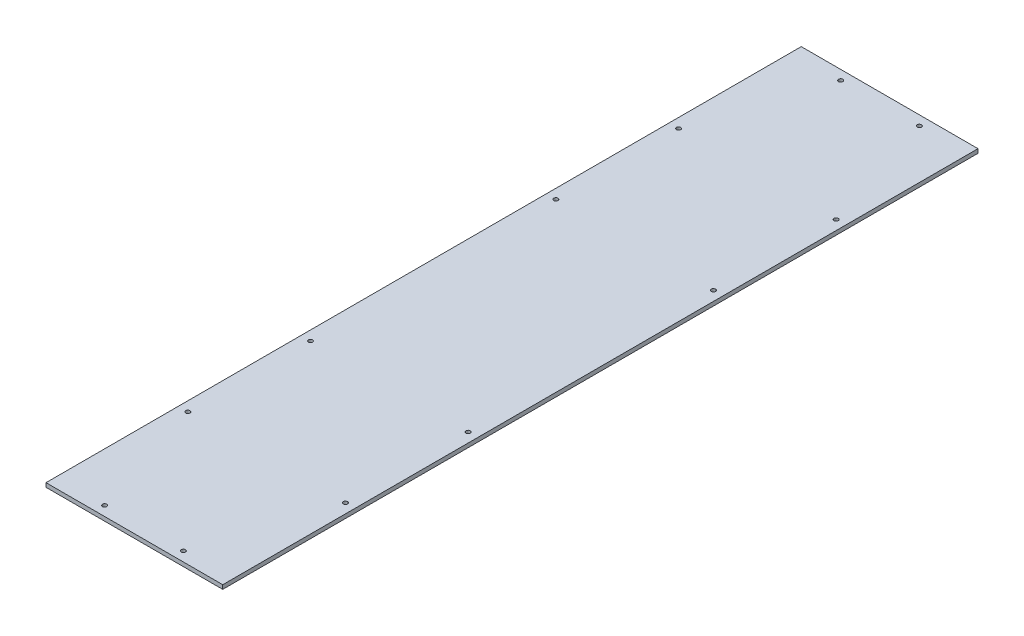
ISO-10303-21;
HEADER;
FILE_DESCRIPTION(('STEP AP214'),'2;1');
FILE_NAME('part.step','',(''),(''),'','','');
FILE_SCHEMA(('AUTOMOTIVE_DESIGN { 1 0 10303 214 1 1 1 1 }'));
ENDSEC;
DATA;
#1=APPLICATION_CONTEXT('core data for automotive mechanical design processes');
#2=APPLICATION_PROTOCOL_DEFINITION('international standard','automotive_design',2000,#1);
#3=PRODUCT_CONTEXT('',#1,'mechanical');
#4=PRODUCT('Part','Part','',(#3));
#5=PRODUCT_RELATED_PRODUCT_CATEGORY('part','',(#4));
#6=PRODUCT_DEFINITION_FORMATION('','',#4);
#7=PRODUCT_DEFINITION_CONTEXT('part definition',#1,'design');
#8=PRODUCT_DEFINITION('design','',#6,#7);
#9=PRODUCT_DEFINITION_SHAPE('','',#8);
#10=(LENGTH_UNIT() NAMED_UNIT(*) SI_UNIT(.MILLI.,.METRE.));
#11=(NAMED_UNIT(*) PLANE_ANGLE_UNIT() SI_UNIT($,.RADIAN.));
#12=(NAMED_UNIT(*) SI_UNIT($,.STERADIAN.) SOLID_ANGLE_UNIT());
#13=UNCERTAINTY_MEASURE_WITH_UNIT(LENGTH_MEASURE(1.E-05),#10,'distance_accuracy_value','');
#14=(GEOMETRIC_REPRESENTATION_CONTEXT(3) GLOBAL_UNCERTAINTY_ASSIGNED_CONTEXT((#13)) GLOBAL_UNIT_ASSIGNED_CONTEXT((#10,
#11,#12)) REPRESENTATION_CONTEXT('',''));
#15=CARTESIAN_POINT('',(0.,0.,0.));
#16=DIRECTION('',(0.,0.,1.));
#17=DIRECTION('',(1.,0.,0.));
#18=AXIS2_PLACEMENT_3D('',#15,#16,#17);
#19=CARTESIAN_POINT('',(0.,3.175,0.));
#20=DIRECTION('',(0.,1.,0.));
#21=DIRECTION('',(0.,0.,1.));
#22=AXIS2_PLACEMENT_3D('',#19,#20,#21);
#23=PLANE('',#22);
#24=CARTESIAN_POINT('',(-61.6,3.175,191.848333333333));
#25=DIRECTION('',(0.,1.,0.));
#26=DIRECTION('',(0.,0.,-1.));
#27=AXIS2_PLACEMENT_3D('',#24,#25,#26);
#28=CIRCLE('',#27,1.65);
#29=CARTESIAN_POINT('',(-61.6,3.175,190.198333333333));
#30=VERTEX_POINT('',#29);
#31=EDGE_CURVE('E169',#30,#30,#28,.T.);
#32=ORIENTED_EDGE('',*,*,#31,.F.);
#33=EDGE_LOOP('',(#32));
#34=FACE_BOUND('',#33,.T.);
#35=CARTESIAN_POINT('',(61.6000000000001,3.175,95.9216666666667));
#36=DIRECTION('',(0.,1.,0.));
#37=DIRECTION('',(0.,0.,1.));
#38=AXIS2_PLACEMENT_3D('',#35,#36,#37);
#39=CIRCLE('',#38,1.65);
#40=CARTESIAN_POINT('',(61.6000000000001,3.175,97.5716666666667));
#41=VERTEX_POINT('',#40);
#42=EDGE_CURVE('E157',#41,#41,#39,.T.);
#43=ORIENTED_EDGE('',*,*,#42,.F.);
#44=EDGE_LOOP('',(#43));
#45=FACE_BOUND('',#44,.T.);
#46=CARTESIAN_POINT('',(30.8000000000001,3.175,287.775));
#47=DIRECTION('',(0.,1.,0.));
#48=DIRECTION('',(0.,0.,1.));
#49=AXIS2_PLACEMENT_3D('',#46,#47,#48);
#50=CIRCLE('',#49,1.65000000000001);
#51=CARTESIAN_POINT('',(30.8000000000001,3.175,289.425));
#52=VERTEX_POINT('',#51);
#53=EDGE_CURVE('E145',#52,#52,#50,.T.);
#54=ORIENTED_EDGE('',*,*,#53,.F.);
#55=EDGE_LOOP('',(#54));
#56=FACE_BOUND('',#55,.T.);
#57=CARTESIAN_POINT('',(61.6000000000001,3.175,-191.848333333333));
#58=DIRECTION('',(0.,1.,0.));
#59=DIRECTION('',(0.,0.,-1.));
#60=AXIS2_PLACEMENT_3D('',#57,#58,#59);
#61=CIRCLE('',#60,1.65);
#62=CARTESIAN_POINT('',(61.6000000000001,3.175,-193.498333333333));
#63=VERTEX_POINT('',#62);
#64=EDGE_CURVE('E133',#63,#63,#61,.T.);
#65=ORIENTED_EDGE('',*,*,#64,.F.);
#66=EDGE_LOOP('',(#65));
#67=FACE_BOUND('',#66,.T.);
#68=CARTESIAN_POINT('',(-61.6,3.175,-95.9216666666666));
#69=DIRECTION('',(0.,1.,0.));
#70=DIRECTION('',(0.,0.,1.));
#71=AXIS2_PLACEMENT_3D('',#68,#69,#70);
#72=CIRCLE('',#71,1.65);
#73=CARTESIAN_POINT('',(-61.6,3.175,-94.2716666666666));
#74=VERTEX_POINT('',#73);
#75=EDGE_CURVE('E121',#74,#74,#72,.T.);
#76=ORIENTED_EDGE('',*,*,#75,.F.);
#77=EDGE_LOOP('',(#76));
#78=FACE_BOUND('',#77,.T.);
#79=CARTESIAN_POINT('',(-30.8,3.175,-287.775));
#80=DIRECTION('',(0.,1.,0.));
#81=DIRECTION('',(0.,0.,1.));
#82=AXIS2_PLACEMENT_3D('',#79,#80,#81);
#83=CIRCLE('',#82,1.65000000000001);
#84=CARTESIAN_POINT('',(-30.8,3.175,-286.125));
#85=VERTEX_POINT('',#84);
#86=EDGE_CURVE('E100',#85,#85,#83,.T.);
#87=ORIENTED_EDGE('',*,*,#86,.F.);
#88=EDGE_LOOP('',(#87));
#89=FACE_BOUND('',#88,.T.);
#90=DIRECTION('',(0.,0.,-1.));
#91=VECTOR('',#90,1.);
#92=CARTESIAN_POINT('',(69.1000000000001,3.175,-295.275));
#93=LINE('',#92,#91);
#94=CARTESIAN_POINT('',(69.1000000000001,3.175,295.275));
#95=VERTEX_POINT('',#94);
#96=CARTESIAN_POINT('',(69.1000000000001,3.175,-295.275));
#97=VERTEX_POINT('',#96);
#98=EDGE_CURVE('E85',#95,#97,#93,.T.);
#99=ORIENTED_EDGE('',*,*,#98,.T.);
#100=DIRECTION('',(-1.,0.,0.));
#101=VECTOR('',#100,1.);
#102=CARTESIAN_POINT('',(-69.0999999999999,3.175,-295.275));
#103=LINE('',#102,#101);
#104=CARTESIAN_POINT('',(-69.0999999999999,3.175,-295.275));
#105=VERTEX_POINT('',#104);
#106=EDGE_CURVE('E80',#97,#105,#103,.T.);
#107=ORIENTED_EDGE('',*,*,#106,.T.);
#108=DIRECTION('',(0.,0.,1.));
#109=VECTOR('',#108,1.);
#110=CARTESIAN_POINT('',(-69.0999999999999,3.175,-295.275));
#111=LINE('',#110,#109);
#112=CARTESIAN_POINT('',(-69.0999999999999,3.175,295.275));
#113=VERTEX_POINT('',#112);
#114=EDGE_CURVE('E83',#105,#113,#111,.T.);
#115=ORIENTED_EDGE('',*,*,#114,.T.);
#116=DIRECTION('',(1.,0.,0.));
#117=VECTOR('',#116,1.);
#118=CARTESIAN_POINT('',(-69.0999999999999,3.175,295.275));
#119=LINE('',#118,#117);
#120=EDGE_CURVE('E50',#113,#95,#119,.T.);
#121=ORIENTED_EDGE('',*,*,#120,.T.);
#122=EDGE_LOOP('',(#99,#107,#115,#121));
#123=FACE_BOUND('',#122,.T.);
#124=CARTESIAN_POINT('',(-61.6,3.175,-191.848333333333));
#125=DIRECTION('',(0.,1.,0.));
#126=DIRECTION('',(0.,0.,1.));
#127=AXIS2_PLACEMENT_3D('',#124,#125,#126);
#128=CIRCLE('',#127,1.65);
#129=CARTESIAN_POINT('',(-61.6,3.175,-190.198333333333));
#130=VERTEX_POINT('',#129);
#131=EDGE_CURVE('E115',#130,#130,#128,.T.);
#132=ORIENTED_EDGE('',*,*,#131,.F.);
#133=EDGE_LOOP('',(#132));
#134=FACE_BOUND('',#133,.T.);
#135=CARTESIAN_POINT('',(61.6000000000001,3.175,-95.9216666666666));
#136=DIRECTION('',(0.,1.,0.));
#137=DIRECTION('',(0.,0.,-1.));
#138=AXIS2_PLACEMENT_3D('',#135,#136,#137);
#139=CIRCLE('',#138,1.65);
#140=CARTESIAN_POINT('',(61.6000000000001,3.175,-97.5716666666666));
#141=VERTEX_POINT('',#140);
#142=EDGE_CURVE('E127',#141,#141,#139,.T.);
#143=ORIENTED_EDGE('',*,*,#142,.F.);
#144=EDGE_LOOP('',(#143));
#145=FACE_BOUND('',#144,.T.);
#146=CARTESIAN_POINT('',(30.8000000000001,3.175,-287.775));
#147=DIRECTION('',(0.,1.,0.));
#148=DIRECTION('',(0.,0.,-1.));
#149=AXIS2_PLACEMENT_3D('',#146,#147,#148);
#150=CIRCLE('',#149,1.65000000000001);
#151=CARTESIAN_POINT('',(30.8000000000001,3.175,-289.425));
#152=VERTEX_POINT('',#151);
#153=EDGE_CURVE('E139',#152,#152,#150,.T.);
#154=ORIENTED_EDGE('',*,*,#153,.F.);
#155=EDGE_LOOP('',(#154));
#156=FACE_BOUND('',#155,.T.);
#157=CARTESIAN_POINT('',(61.6000000000001,3.175,191.848333333333));
#158=DIRECTION('',(0.,1.,0.));
#159=DIRECTION('',(0.,0.,1.));
#160=AXIS2_PLACEMENT_3D('',#157,#158,#159);
#161=CIRCLE('',#160,1.65);
#162=CARTESIAN_POINT('',(61.6000000000001,3.175,193.498333333333));
#163=VERTEX_POINT('',#162);
#164=EDGE_CURVE('E151',#163,#163,#161,.T.);
#165=ORIENTED_EDGE('',*,*,#164,.F.);
#166=EDGE_LOOP('',(#165));
#167=FACE_BOUND('',#166,.T.);
#168=CARTESIAN_POINT('',(-61.6,3.175,95.9216666666667));
#169=DIRECTION('',(0.,1.,0.));
#170=DIRECTION('',(0.,0.,-1.));
#171=AXIS2_PLACEMENT_3D('',#168,#169,#170);
#172=CIRCLE('',#171,1.65);
#173=CARTESIAN_POINT('',(-61.6,3.175,94.2716666666667));
#174=VERTEX_POINT('',#173);
#175=EDGE_CURVE('E163',#174,#174,#172,.T.);
#176=ORIENTED_EDGE('',*,*,#175,.F.);
#177=EDGE_LOOP('',(#176));
#178=FACE_BOUND('',#177,.T.);
#179=CARTESIAN_POINT('',(-30.8,3.175,287.775));
#180=DIRECTION('',(0.,1.,0.));
#181=DIRECTION('',(0.,0.,-1.));
#182=AXIS2_PLACEMENT_3D('',#179,#180,#181);
#183=CIRCLE('',#182,1.65000000000001);
#184=CARTESIAN_POINT('',(-30.8,3.175,286.125));
#185=VERTEX_POINT('',#184);
#186=EDGE_CURVE('E175',#185,#185,#183,.T.);
#187=ORIENTED_EDGE('',*,*,#186,.F.);
#188=EDGE_LOOP('',(#187));
#189=FACE_BOUND('',#188,.T.);
#190=ADVANCED_FACE('F33',(#34,#45,#56,#67,#78,#89,#123,#134,#145,#156,#167,#178,#189),#23,.T.);
#191=CARTESIAN_POINT('',(0.,0.,0.));
#192=DIRECTION('',(0.,1.,0.));
#193=DIRECTION('',(0.,0.,1.));
#194=AXIS2_PLACEMENT_3D('',#191,#192,#193);
#195=PLANE('',#194);
#196=DIRECTION('',(0.,0.,-1.));
#197=VECTOR('',#196,1.);
#198=CARTESIAN_POINT('',(69.1000000000001,0.,-295.275));
#199=LINE('',#198,#197);
#200=CARTESIAN_POINT('',(69.1000000000001,0.,295.275));
#201=VERTEX_POINT('',#200);
#202=CARTESIAN_POINT('',(69.1000000000001,0.,-295.275));
#203=VERTEX_POINT('',#202);
#204=EDGE_CURVE('E97',#201,#203,#199,.T.);
#205=ORIENTED_EDGE('',*,*,#204,.F.);
#206=DIRECTION('',(1.,0.,0.));
#207=VECTOR('',#206,1.);
#208=CARTESIAN_POINT('',(-69.0999999999999,0.,295.275));
#209=LINE('',#208,#207);
#210=CARTESIAN_POINT('',(-69.0999999999999,0.,295.275));
#211=VERTEX_POINT('',#210);
#212=EDGE_CURVE('E73',#211,#201,#209,.T.);
#213=ORIENTED_EDGE('',*,*,#212,.F.);
#214=DIRECTION('',(0.,0.,1.));
#215=VECTOR('',#214,1.);
#216=CARTESIAN_POINT('',(-69.0999999999999,0.,-295.275));
#217=LINE('',#216,#215);
#218=CARTESIAN_POINT('',(-69.0999999999999,0.,-295.275));
#219=VERTEX_POINT('',#218);
#220=EDGE_CURVE('E67',#219,#211,#217,.T.);
#221=ORIENTED_EDGE('',*,*,#220,.F.);
#222=DIRECTION('',(-1.,0.,0.));
#223=VECTOR('',#222,1.);
#224=CARTESIAN_POINT('',(-69.0999999999999,0.,-295.275));
#225=LINE('',#224,#223);
#226=EDGE_CURVE('E89',#203,#219,#225,.T.);
#227=ORIENTED_EDGE('',*,*,#226,.F.);
#228=EDGE_LOOP('',(#205,#213,#221,#227));
#229=FACE_BOUND('',#228,.T.);
#230=CARTESIAN_POINT('',(-30.8,0.,-287.775));
#231=DIRECTION('',(0.,1.,0.));
#232=DIRECTION('',(0.,0.,1.));
#233=AXIS2_PLACEMENT_3D('',#230,#231,#232);
#234=CIRCLE('',#233,1.65000000000001);
#235=CARTESIAN_POINT('',(-30.8,0.,-286.125));
#236=VERTEX_POINT('',#235);
#237=EDGE_CURVE('E112',#236,#236,#234,.T.);
#238=ORIENTED_EDGE('',*,*,#237,.T.);
#239=EDGE_LOOP('',(#238));
#240=FACE_BOUND('',#239,.T.);
#241=CARTESIAN_POINT('',(-61.6,0.,-191.848333333333));
#242=DIRECTION('',(0.,1.,0.));
#243=DIRECTION('',(0.,0.,1.));
#244=AXIS2_PLACEMENT_3D('',#241,#242,#243);
#245=CIRCLE('',#244,1.65);
#246=CARTESIAN_POINT('',(-61.6,0.,-190.198333333333));
#247=VERTEX_POINT('',#246);
#248=EDGE_CURVE('E118',#247,#247,#245,.T.);
#249=ORIENTED_EDGE('',*,*,#248,.T.);
#250=EDGE_LOOP('',(#249));
#251=FACE_BOUND('',#250,.T.);
#252=CARTESIAN_POINT('',(-61.6,0.,-95.9216666666666));
#253=DIRECTION('',(0.,1.,0.));
#254=DIRECTION('',(0.,0.,1.));
#255=AXIS2_PLACEMENT_3D('',#252,#253,#254);
#256=CIRCLE('',#255,1.65);
#257=CARTESIAN_POINT('',(-61.6,0.,-94.2716666666666));
#258=VERTEX_POINT('',#257);
#259=EDGE_CURVE('E124',#258,#258,#256,.T.);
#260=ORIENTED_EDGE('',*,*,#259,.T.);
#261=EDGE_LOOP('',(#260));
#262=FACE_BOUND('',#261,.T.);
#263=CARTESIAN_POINT('',(61.6000000000001,0.,-95.9216666666666));
#264=DIRECTION('',(0.,1.,0.));
#265=DIRECTION('',(0.,0.,-1.));
#266=AXIS2_PLACEMENT_3D('',#263,#264,#265);
#267=CIRCLE('',#266,1.65);
#268=CARTESIAN_POINT('',(61.6000000000001,0.,-97.5716666666666));
#269=VERTEX_POINT('',#268);
#270=EDGE_CURVE('E130',#269,#269,#267,.T.);
#271=ORIENTED_EDGE('',*,*,#270,.T.);
#272=EDGE_LOOP('',(#271));
#273=FACE_BOUND('',#272,.T.);
#274=CARTESIAN_POINT('',(61.6000000000001,0.,-191.848333333333));
#275=DIRECTION('',(0.,1.,0.));
#276=DIRECTION('',(0.,0.,-1.));
#277=AXIS2_PLACEMENT_3D('',#274,#275,#276);
#278=CIRCLE('',#277,1.65);
#279=CARTESIAN_POINT('',(61.6000000000001,0.,-193.498333333333));
#280=VERTEX_POINT('',#279);
#281=EDGE_CURVE('E136',#280,#280,#278,.T.);
#282=ORIENTED_EDGE('',*,*,#281,.T.);
#283=EDGE_LOOP('',(#282));
#284=FACE_BOUND('',#283,.T.);
#285=CARTESIAN_POINT('',(30.8000000000001,0.,-287.775));
#286=DIRECTION('',(0.,1.,0.));
#287=DIRECTION('',(0.,0.,-1.));
#288=AXIS2_PLACEMENT_3D('',#285,#286,#287);
#289=CIRCLE('',#288,1.65000000000001);
#290=CARTESIAN_POINT('',(30.8000000000001,0.,-289.425));
#291=VERTEX_POINT('',#290);
#292=EDGE_CURVE('E142',#291,#291,#289,.T.);
#293=ORIENTED_EDGE('',*,*,#292,.T.);
#294=EDGE_LOOP('',(#293));
#295=FACE_BOUND('',#294,.T.);
#296=CARTESIAN_POINT('',(30.8000000000001,0.,287.775));
#297=DIRECTION('',(0.,1.,0.));
#298=DIRECTION('',(0.,0.,1.));
#299=AXIS2_PLACEMENT_3D('',#296,#297,#298);
#300=CIRCLE('',#299,1.65000000000001);
#301=CARTESIAN_POINT('',(30.8000000000001,0.,289.425));
#302=VERTEX_POINT('',#301);
#303=EDGE_CURVE('E148',#302,#302,#300,.T.);
#304=ORIENTED_EDGE('',*,*,#303,.T.);
#305=EDGE_LOOP('',(#304));
#306=FACE_BOUND('',#305,.T.);
#307=CARTESIAN_POINT('',(61.6000000000001,0.,191.848333333333));
#308=DIRECTION('',(0.,1.,0.));
#309=DIRECTION('',(0.,0.,1.));
#310=AXIS2_PLACEMENT_3D('',#307,#308,#309);
#311=CIRCLE('',#310,1.65);
#312=CARTESIAN_POINT('',(61.6000000000001,0.,193.498333333333));
#313=VERTEX_POINT('',#312);
#314=EDGE_CURVE('E154',#313,#313,#311,.T.);
#315=ORIENTED_EDGE('',*,*,#314,.T.);
#316=EDGE_LOOP('',(#315));
#317=FACE_BOUND('',#316,.T.);
#318=CARTESIAN_POINT('',(61.6000000000001,0.,95.9216666666667));
#319=DIRECTION('',(0.,1.,0.));
#320=DIRECTION('',(0.,0.,1.));
#321=AXIS2_PLACEMENT_3D('',#318,#319,#320);
#322=CIRCLE('',#321,1.65);
#323=CARTESIAN_POINT('',(61.6000000000001,0.,97.5716666666667));
#324=VERTEX_POINT('',#323);
#325=EDGE_CURVE('E160',#324,#324,#322,.T.);
#326=ORIENTED_EDGE('',*,*,#325,.T.);
#327=EDGE_LOOP('',(#326));
#328=FACE_BOUND('',#327,.T.);
#329=CARTESIAN_POINT('',(-61.6,0.,95.9216666666667));
#330=DIRECTION('',(0.,1.,0.));
#331=DIRECTION('',(0.,0.,-1.));
#332=AXIS2_PLACEMENT_3D('',#329,#330,#331);
#333=CIRCLE('',#332,1.65);
#334=CARTESIAN_POINT('',(-61.6,0.,94.2716666666667));
#335=VERTEX_POINT('',#334);
#336=EDGE_CURVE('E166',#335,#335,#333,.T.);
#337=ORIENTED_EDGE('',*,*,#336,.T.);
#338=EDGE_LOOP('',(#337));
#339=FACE_BOUND('',#338,.T.);
#340=CARTESIAN_POINT('',(-61.6,0.,191.848333333333));
#341=DIRECTION('',(0.,1.,0.));
#342=DIRECTION('',(0.,0.,-1.));
#343=AXIS2_PLACEMENT_3D('',#340,#341,#342);
#344=CIRCLE('',#343,1.65);
#345=CARTESIAN_POINT('',(-61.6,0.,190.198333333333));
#346=VERTEX_POINT('',#345);
#347=EDGE_CURVE('E172',#346,#346,#344,.T.);
#348=ORIENTED_EDGE('',*,*,#347,.T.);
#349=EDGE_LOOP('',(#348));
#350=FACE_BOUND('',#349,.T.);
#351=CARTESIAN_POINT('',(-30.8,0.,287.775));
#352=DIRECTION('',(0.,1.,0.));
#353=DIRECTION('',(0.,0.,-1.));
#354=AXIS2_PLACEMENT_3D('',#351,#352,#353);
#355=CIRCLE('',#354,1.65000000000001);
#356=CARTESIAN_POINT('',(-30.8,0.,286.125));
#357=VERTEX_POINT('',#356);
#358=EDGE_CURVE('E178',#357,#357,#355,.T.);
#359=ORIENTED_EDGE('',*,*,#358,.T.);
#360=EDGE_LOOP('',(#359));
#361=FACE_BOUND('',#360,.T.);
#362=ADVANCED_FACE('F108',(#229,#240,#251,#262,#273,#284,#295,#306,#317,#328,#339,#350,#361),
#195,.F.);
#363=CARTESIAN_POINT('',(69.1000000000001,3.175,-295.275));
#364=DIRECTION('',(-1.,0.,0.));
#365=DIRECTION('',(0.,0.,1.));
#366=AXIS2_PLACEMENT_3D('',#363,#364,#365);
#367=PLANE('',#366);
#368=ORIENTED_EDGE('',*,*,#204,.T.);
#369=DIRECTION('',(0.,-1.,0.));
#370=VECTOR('',#369,1.);
#371=CARTESIAN_POINT('',(69.1000000000001,3.175,-295.275));
#372=LINE('',#371,#370);
#373=EDGE_CURVE('E11',#97,#203,#372,.T.);
#374=ORIENTED_EDGE('',*,*,#373,.F.);
#375=ORIENTED_EDGE('',*,*,#98,.F.);
#376=DIRECTION('',(0.,-1.,0.));
#377=VECTOR('',#376,1.);
#378=CARTESIAN_POINT('',(69.1000000000001,3.175,295.275));
#379=LINE('',#378,#377);
#380=EDGE_CURVE('E93',#95,#201,#379,.T.);
#381=ORIENTED_EDGE('',*,*,#380,.T.);
#382=EDGE_LOOP('',(#368,#374,#375,#381));
#383=FACE_BOUND('',#382,.T.);
#384=ADVANCED_FACE('F35',(#383),#367,.F.);
#385=CARTESIAN_POINT('',(-69.0999999999999,3.175,-295.275));
#386=DIRECTION('',(0.,0.,1.));
#387=DIRECTION('',(1.,0.,0.));
#388=AXIS2_PLACEMENT_3D('',#385,#386,#387);
#389=PLANE('',#388);
#390=ORIENTED_EDGE('',*,*,#226,.T.);
#391=DIRECTION('',(0.,-1.,0.));
#392=VECTOR('',#391,1.);
#393=CARTESIAN_POINT('',(-69.0999999999999,3.175,-295.275));
#394=LINE('',#393,#392);
#395=EDGE_CURVE('E42',#105,#219,#394,.T.);
#396=ORIENTED_EDGE('',*,*,#395,.F.);
#397=ORIENTED_EDGE('',*,*,#106,.F.);
#398=ORIENTED_EDGE('',*,*,#373,.T.);
#399=EDGE_LOOP('',(#390,#396,#397,#398));
#400=FACE_BOUND('',#399,.T.);
#401=ADVANCED_FACE('F88',(#400),#389,.F.);
#402=CARTESIAN_POINT('',(-69.0999999999999,3.175,-295.275));
#403=DIRECTION('',(1.,0.,0.));
#404=DIRECTION('',(0.,0.,-1.));
#405=AXIS2_PLACEMENT_3D('',#402,#403,#404);
#406=PLANE('',#405);
#407=ORIENTED_EDGE('',*,*,#220,.T.);
#408=DIRECTION('',(0.,-1.,0.));
#409=VECTOR('',#408,1.);
#410=CARTESIAN_POINT('',(-69.0999999999999,3.175,295.275));
#411=LINE('',#410,#409);
#412=EDGE_CURVE('E90',#113,#211,#411,.T.);
#413=ORIENTED_EDGE('',*,*,#412,.F.);
#414=ORIENTED_EDGE('',*,*,#114,.F.);
#415=ORIENTED_EDGE('',*,*,#395,.T.);
#416=EDGE_LOOP('',(#407,#413,#414,#415));
#417=FACE_BOUND('',#416,.T.);
#418=ADVANCED_FACE('F91',(#417),#406,.F.);
#419=CARTESIAN_POINT('',(-69.0999999999999,3.175,295.275));
#420=DIRECTION('',(0.,0.,-1.));
#421=DIRECTION('',(-1.,0.,0.));
#422=AXIS2_PLACEMENT_3D('',#419,#420,#421);
#423=PLANE('',#422);
#424=ORIENTED_EDGE('',*,*,#212,.T.);
#425=ORIENTED_EDGE('',*,*,#380,.F.);
#426=ORIENTED_EDGE('',*,*,#120,.F.);
#427=ORIENTED_EDGE('',*,*,#412,.T.);
#428=EDGE_LOOP('',(#424,#425,#426,#427));
#429=FACE_BOUND('',#428,.T.);
#430=ADVANCED_FACE('F105',(#429),#423,.F.);
#431=CARTESIAN_POINT('',(-30.8,3.175,-287.775));
#432=DIRECTION('',(0.,-1.,0.));
#433=DIRECTION('',(0.,0.,-1.));
#434=AXIS2_PLACEMENT_3D('',#431,#432,#433);
#435=CYLINDRICAL_SURFACE('',#434,1.65000000000001);
#436=ORIENTED_EDGE('',*,*,#86,.T.);
#437=EDGE_LOOP('',(#436));
#438=FACE_BOUND('',#437,.T.);
#439=ORIENTED_EDGE('',*,*,#237,.F.);
#440=EDGE_LOOP('',(#439));
#441=FACE_BOUND('',#440,.T.);
#442=ADVANCED_FACE('F197',(#438,#441),#435,.F.);
#443=CARTESIAN_POINT('',(-61.6,3.175,-191.848333333333));
#444=DIRECTION('',(0.,-1.,0.));
#445=DIRECTION('',(0.,0.,-1.));
#446=AXIS2_PLACEMENT_3D('',#443,#444,#445);
#447=CYLINDRICAL_SURFACE('',#446,1.65);
#448=ORIENTED_EDGE('',*,*,#131,.T.);
#449=EDGE_LOOP('',(#448));
#450=FACE_BOUND('',#449,.T.);
#451=ORIENTED_EDGE('',*,*,#248,.F.);
#452=EDGE_LOOP('',(#451));
#453=FACE_BOUND('',#452,.T.);
#454=ADVANCED_FACE('F243',(#450,#453),#447,.F.);
#455=CARTESIAN_POINT('',(-61.6,3.175,-95.9216666666666));
#456=DIRECTION('',(0.,-1.,0.));
#457=DIRECTION('',(0.,0.,-1.));
#458=AXIS2_PLACEMENT_3D('',#455,#456,#457);
#459=CYLINDRICAL_SURFACE('',#458,1.65);
#460=ORIENTED_EDGE('',*,*,#75,.T.);
#461=EDGE_LOOP('',(#460));
#462=FACE_BOUND('',#461,.T.);
#463=ORIENTED_EDGE('',*,*,#259,.F.);
#464=EDGE_LOOP('',(#463));
#465=FACE_BOUND('',#464,.T.);
#466=ADVANCED_FACE('F251',(#462,#465),#459,.F.);
#467=CARTESIAN_POINT('',(61.6000000000001,3.175,-95.9216666666666));
#468=DIRECTION('',(0.,-1.,0.));
#469=DIRECTION('',(0.,0.,-1.));
#470=AXIS2_PLACEMENT_3D('',#467,#468,#469);
#471=CYLINDRICAL_SURFACE('',#470,1.65);
#472=ORIENTED_EDGE('',*,*,#142,.T.);
#473=EDGE_LOOP('',(#472));
#474=FACE_BOUND('',#473,.T.);
#475=ORIENTED_EDGE('',*,*,#270,.F.);
#476=EDGE_LOOP('',(#475));
#477=FACE_BOUND('',#476,.T.);
#478=ADVANCED_FACE('F259',(#474,#477),#471,.F.);
#479=CARTESIAN_POINT('',(61.6000000000001,3.175,-191.848333333333));
#480=DIRECTION('',(0.,-1.,0.));
#481=DIRECTION('',(0.,0.,-1.));
#482=AXIS2_PLACEMENT_3D('',#479,#480,#481);
#483=CYLINDRICAL_SURFACE('',#482,1.65);
#484=ORIENTED_EDGE('',*,*,#64,.T.);
#485=EDGE_LOOP('',(#484));
#486=FACE_BOUND('',#485,.T.);
#487=ORIENTED_EDGE('',*,*,#281,.F.);
#488=EDGE_LOOP('',(#487));
#489=FACE_BOUND('',#488,.T.);
#490=ADVANCED_FACE('F268',(#486,#489),#483,.F.);
#491=CARTESIAN_POINT('',(30.8000000000001,3.175,-287.775));
#492=DIRECTION('',(0.,-1.,0.));
#493=DIRECTION('',(0.,0.,-1.));
#494=AXIS2_PLACEMENT_3D('',#491,#492,#493);
#495=CYLINDRICAL_SURFACE('',#494,1.65000000000001);
#496=ORIENTED_EDGE('',*,*,#153,.T.);
#497=EDGE_LOOP('',(#496));
#498=FACE_BOUND('',#497,.T.);
#499=ORIENTED_EDGE('',*,*,#292,.F.);
#500=EDGE_LOOP('',(#499));
#501=FACE_BOUND('',#500,.T.);
#502=ADVANCED_FACE('F277',(#498,#501),#495,.F.);
#503=CARTESIAN_POINT('',(30.8000000000001,3.175,287.775));
#504=DIRECTION('',(0.,-1.,0.));
#505=DIRECTION('',(0.,0.,-1.));
#506=AXIS2_PLACEMENT_3D('',#503,#504,#505);
#507=CYLINDRICAL_SURFACE('',#506,1.65000000000001);
#508=ORIENTED_EDGE('',*,*,#53,.T.);
#509=EDGE_LOOP('',(#508));
#510=FACE_BOUND('',#509,.T.);
#511=ORIENTED_EDGE('',*,*,#303,.F.);
#512=EDGE_LOOP('',(#511));
#513=FACE_BOUND('',#512,.T.);
#514=ADVANCED_FACE('F286',(#510,#513),#507,.F.);
#515=CARTESIAN_POINT('',(61.6000000000001,3.175,191.848333333333));
#516=DIRECTION('',(0.,-1.,0.));
#517=DIRECTION('',(0.,0.,-1.));
#518=AXIS2_PLACEMENT_3D('',#515,#516,#517);
#519=CYLINDRICAL_SURFACE('',#518,1.65);
#520=ORIENTED_EDGE('',*,*,#164,.T.);
#521=EDGE_LOOP('',(#520));
#522=FACE_BOUND('',#521,.T.);
#523=ORIENTED_EDGE('',*,*,#314,.F.);
#524=EDGE_LOOP('',(#523));
#525=FACE_BOUND('',#524,.T.);
#526=ADVANCED_FACE('F295',(#522,#525),#519,.F.);
#527=CARTESIAN_POINT('',(61.6000000000001,3.175,95.9216666666667));
#528=DIRECTION('',(0.,-1.,0.));
#529=DIRECTION('',(0.,0.,-1.));
#530=AXIS2_PLACEMENT_3D('',#527,#528,#529);
#531=CYLINDRICAL_SURFACE('',#530,1.65);
#532=ORIENTED_EDGE('',*,*,#42,.T.);
#533=EDGE_LOOP('',(#532));
#534=FACE_BOUND('',#533,.T.);
#535=ORIENTED_EDGE('',*,*,#325,.F.);
#536=EDGE_LOOP('',(#535));
#537=FACE_BOUND('',#536,.T.);
#538=ADVANCED_FACE('F304',(#534,#537),#531,.F.);
#539=CARTESIAN_POINT('',(-61.6,3.175,95.9216666666667));
#540=DIRECTION('',(0.,-1.,0.));
#541=DIRECTION('',(0.,0.,-1.));
#542=AXIS2_PLACEMENT_3D('',#539,#540,#541);
#543=CYLINDRICAL_SURFACE('',#542,1.65);
#544=ORIENTED_EDGE('',*,*,#175,.T.);
#545=EDGE_LOOP('',(#544));
#546=FACE_BOUND('',#545,.T.);
#547=ORIENTED_EDGE('',*,*,#336,.F.);
#548=EDGE_LOOP('',(#547));
#549=FACE_BOUND('',#548,.T.);
#550=ADVANCED_FACE('F313',(#546,#549),#543,.F.);
#551=CARTESIAN_POINT('',(-61.6,3.175,191.848333333333));
#552=DIRECTION('',(0.,-1.,0.));
#553=DIRECTION('',(0.,0.,-1.));
#554=AXIS2_PLACEMENT_3D('',#551,#552,#553);
#555=CYLINDRICAL_SURFACE('',#554,1.65);
#556=ORIENTED_EDGE('',*,*,#31,.T.);
#557=EDGE_LOOP('',(#556));
#558=FACE_BOUND('',#557,.T.);
#559=ORIENTED_EDGE('',*,*,#347,.F.);
#560=EDGE_LOOP('',(#559));
#561=FACE_BOUND('',#560,.T.);
#562=ADVANCED_FACE('F322',(#558,#561),#555,.F.);
#563=CARTESIAN_POINT('',(-30.8,3.175,287.775));
#564=DIRECTION('',(0.,-1.,0.));
#565=DIRECTION('',(0.,0.,-1.));
#566=AXIS2_PLACEMENT_3D('',#563,#564,#565);
#567=CYLINDRICAL_SURFACE('',#566,1.65000000000001);
#568=ORIENTED_EDGE('',*,*,#186,.T.);
#569=EDGE_LOOP('',(#568));
#570=FACE_BOUND('',#569,.T.);
#571=ORIENTED_EDGE('',*,*,#358,.F.);
#572=EDGE_LOOP('',(#571));
#573=FACE_BOUND('',#572,.T.);
#574=ADVANCED_FACE('F184',(#570,#573),#567,.F.);
#575=CLOSED_SHELL('',(#190,#362,#384,#401,#418,#430,#442,#454,#466,#478,#490,#502,#514,#526,
#538,#550,#562,#574));
#576=MANIFOLD_SOLID_BREP('B2',#575);
#577=ADVANCED_BREP_SHAPE_REPRESENTATION('',(#18,#576),#14);
#578=SHAPE_DEFINITION_REPRESENTATION(#9,#577);
ENDSEC;
END-ISO-10303-21;
